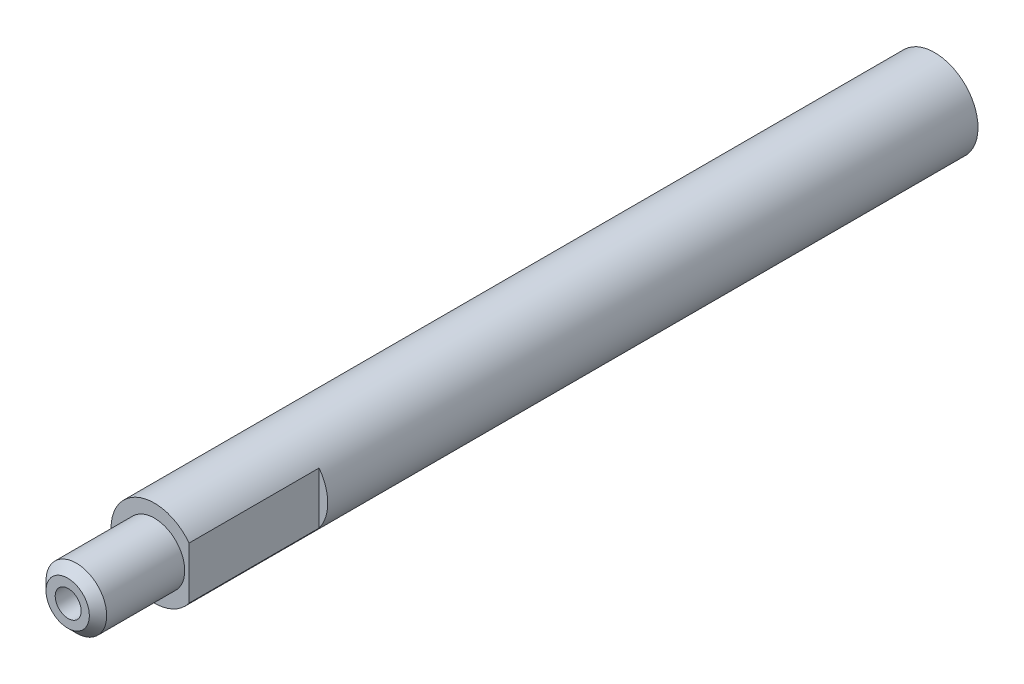
ISO-10303-21;
HEADER;
FILE_DESCRIPTION(('STEP AP214'),'2;1');
FILE_NAME('part.step','',(''),(''),'','','');
FILE_SCHEMA(('AUTOMOTIVE_DESIGN { 1 0 10303 214 1 1 1 1 }'));
ENDSEC;
DATA;
#1=APPLICATION_CONTEXT('core data for automotive mechanical design processes');
#2=APPLICATION_PROTOCOL_DEFINITION('international standard','automotive_design',2000,#1);
#3=PRODUCT_CONTEXT('',#1,'mechanical');
#4=PRODUCT('Part','Part','',(#3));
#5=PRODUCT_RELATED_PRODUCT_CATEGORY('part','',(#4));
#6=PRODUCT_DEFINITION_FORMATION('','',#4);
#7=PRODUCT_DEFINITION_CONTEXT('part definition',#1,'design');
#8=PRODUCT_DEFINITION('design','',#6,#7);
#9=PRODUCT_DEFINITION_SHAPE('','',#8);
#10=(LENGTH_UNIT() NAMED_UNIT(*) SI_UNIT(.MILLI.,.METRE.));
#11=(NAMED_UNIT(*) PLANE_ANGLE_UNIT() SI_UNIT($,.RADIAN.));
#12=(NAMED_UNIT(*) SI_UNIT($,.STERADIAN.) SOLID_ANGLE_UNIT());
#13=UNCERTAINTY_MEASURE_WITH_UNIT(LENGTH_MEASURE(1.E-05),#10,'distance_accuracy_value','');
#14=(GEOMETRIC_REPRESENTATION_CONTEXT(3) GLOBAL_UNCERTAINTY_ASSIGNED_CONTEXT((#13)) GLOBAL_UNIT_ASSIGNED_CONTEXT((#10,
#11,#12)) REPRESENTATION_CONTEXT('',''));
#15=CARTESIAN_POINT('',(0.,0.,0.));
#16=DIRECTION('',(0.,0.,1.));
#17=DIRECTION('',(1.,0.,0.));
#18=AXIS2_PLACEMENT_3D('',#15,#16,#17);
#19=CARTESIAN_POINT('',(0.,0.,100.));
#20=DIRECTION('',(0.,0.,-1.));
#21=DIRECTION('',(-1.,0.,0.));
#22=AXIS2_PLACEMENT_3D('',#19,#20,#21);
#23=CYLINDRICAL_SURFACE('',#22,5.);
#24=CARTESIAN_POINT('',(0.,0.,90.));
#25=DIRECTION('',(0.,0.,1.));
#26=DIRECTION('',(1.,0.,0.));
#27=AXIS2_PLACEMENT_3D('',#24,#25,#26);
#28=CIRCLE('',#27,5.);
#29=CARTESIAN_POINT('',(4.,3.,90.));
#30=VERTEX_POINT('',#29);
#31=CARTESIAN_POINT('',(4.,-3.,90.));
#32=VERTEX_POINT('',#31);
#33=EDGE_CURVE('E101',#30,#32,#28,.T.);
#34=ORIENTED_EDGE('',*,*,#33,.F.);
#35=DIRECTION('',(0.,0.,1.));
#36=VECTOR('',#35,1.);
#37=CARTESIAN_POINT('',(4.,3.,75.));
#38=LINE('',#37,#36);
#39=CARTESIAN_POINT('',(4.,3.,75.));
#40=VERTEX_POINT('',#39);
#41=EDGE_CURVE('E52',#40,#30,#38,.T.);
#42=ORIENTED_EDGE('',*,*,#41,.F.);
#43=CARTESIAN_POINT('',(0.,0.,75.));
#44=DIRECTION('',(0.,0.,1.));
#45=DIRECTION('',(1.,0.,0.));
#46=AXIS2_PLACEMENT_3D('',#43,#44,#45);
#47=CIRCLE('',#46,5.);
#48=CARTESIAN_POINT('',(4.,-3.,75.));
#49=VERTEX_POINT('',#48);
#50=EDGE_CURVE('E81',#49,#40,#47,.T.);
#51=ORIENTED_EDGE('',*,*,#50,.F.);
#52=DIRECTION('',(0.,0.,1.));
#53=VECTOR('',#52,1.);
#54=CARTESIAN_POINT('',(4.,-3.,75.));
#55=LINE('',#54,#53);
#56=EDGE_CURVE('E88',#49,#32,#55,.T.);
#57=ORIENTED_EDGE('',*,*,#56,.T.);
#58=EDGE_LOOP('',(#34,#42,#51,#57));
#59=FACE_BOUND('',#58,.T.);
#60=CARTESIAN_POINT('',(0.,0.,0.));
#61=DIRECTION('',(0.,0.,1.));
#62=DIRECTION('',(1.,0.,0.));
#63=AXIS2_PLACEMENT_3D('',#60,#61,#62);
#64=CIRCLE('',#63,5.);
#65=CARTESIAN_POINT('',(5.,0.,0.));
#66=VERTEX_POINT('',#65);
#67=EDGE_CURVE('E102',#66,#66,#64,.T.);
#68=ORIENTED_EDGE('',*,*,#67,.T.);
#69=EDGE_LOOP('',(#68));
#70=FACE_BOUND('',#69,.T.);
#71=ADVANCED_FACE('F37',(#59,#70),#23,.T.);
#72=CARTESIAN_POINT('',(0.,0.,0.));
#73=DIRECTION('',(0.,0.,1.));
#74=DIRECTION('',(1.,0.,0.));
#75=AXIS2_PLACEMENT_3D('',#72,#73,#74);
#76=PLANE('',#75);
#77=CARTESIAN_POINT('',(0.,0.,0.));
#78=DIRECTION('',(0.,0.,-1.));
#79=DIRECTION('',(-1.,0.,0.));
#80=AXIS2_PLACEMENT_3D('',#77,#78,#79);
#81=CIRCLE('',#80,2.);
#82=CARTESIAN_POINT('',(-2.,0.,0.));
#83=VERTEX_POINT('',#82);
#84=EDGE_CURVE('E78',#83,#83,#81,.T.);
#85=ORIENTED_EDGE('',*,*,#84,.F.);
#86=EDGE_LOOP('',(#85));
#87=FACE_BOUND('',#86,.T.);
#88=ORIENTED_EDGE('',*,*,#67,.F.);
#89=EDGE_LOOP('',(#88));
#90=FACE_BOUND('',#89,.T.);
#91=ADVANCED_FACE('F138',(#87,#90),#76,.F.);
#92=CARTESIAN_POINT('',(0.,0.,90.));
#93=DIRECTION('',(0.,0.,1.));
#94=DIRECTION('',(1.,0.,0.));
#95=AXIS2_PLACEMENT_3D('',#92,#93,#94);
#96=PLANE('',#95);
#97=DIRECTION('',(0.,-1.,0.));
#98=VECTOR('',#97,1.);
#99=CARTESIAN_POINT('',(4.,0.,90.));
#100=LINE('',#99,#98);
#101=EDGE_CURVE('E12',#30,#32,#100,.T.);
#102=ORIENTED_EDGE('',*,*,#101,.F.);
#103=ORIENTED_EDGE('',*,*,#33,.T.);
#104=EDGE_LOOP('',(#102,#103));
#105=FACE_BOUND('',#104,.T.);
#106=CARTESIAN_POINT('',(0.,0.,90.));
#107=DIRECTION('',(0.,0.,1.));
#108=DIRECTION('',(1.,0.,0.));
#109=AXIS2_PLACEMENT_3D('',#106,#107,#108);
#110=CIRCLE('',#109,3.5);
#111=CARTESIAN_POINT('',(3.5,0.,90.));
#112=VERTEX_POINT('',#111);
#113=EDGE_CURVE('E98',#112,#112,#110,.T.);
#114=ORIENTED_EDGE('',*,*,#113,.F.);
#115=EDGE_LOOP('',(#114));
#116=FACE_BOUND('',#115,.T.);
#117=ADVANCED_FACE('F143',(#105,#116),#96,.T.);
#118=CARTESIAN_POINT('',(0.,0.,90.));
#119=DIRECTION('',(0.,0.,1.));
#120=DIRECTION('',(1.,0.,0.));
#121=AXIS2_PLACEMENT_3D('',#118,#119,#120);
#122=CYLINDRICAL_SURFACE('',#121,3.5);
#123=CARTESIAN_POINT('',(0.,0.,99.));
#124=DIRECTION('',(0.,0.,1.));
#125=DIRECTION('',(1.,0.,0.));
#126=AXIS2_PLACEMENT_3D('',#123,#124,#125);
#127=CIRCLE('',#126,3.5);
#128=CARTESIAN_POINT('',(3.5,0.,99.));
#129=VERTEX_POINT('',#128);
#130=EDGE_CURVE('E46',#129,#129,#127,.F.);
#131=ORIENTED_EDGE('',*,*,#130,.T.);
#132=EDGE_LOOP('',(#131));
#133=FACE_BOUND('',#132,.T.);
#134=ORIENTED_EDGE('',*,*,#113,.T.);
#135=EDGE_LOOP('',(#134));
#136=FACE_BOUND('',#135,.T.);
#137=ADVANCED_FACE('F112',(#133,#136),#122,.T.);
#138=CARTESIAN_POINT('',(0.,0.,100.));
#139=DIRECTION('',(0.,0.,1.));
#140=DIRECTION('',(1.,0.,0.));
#141=AXIS2_PLACEMENT_3D('',#138,#139,#140);
#142=PLANE('',#141);
#143=CARTESIAN_POINT('',(0.,0.,100.));
#144=DIRECTION('',(0.,0.,1.));
#145=DIRECTION('',(1.,0.,0.));
#146=AXIS2_PLACEMENT_3D('',#143,#144,#145);
#147=CIRCLE('',#146,2.5);
#148=CARTESIAN_POINT('',(2.5,0.,100.));
#149=VERTEX_POINT('',#148);
#150=EDGE_CURVE('E105',#149,#149,#147,.T.);
#151=ORIENTED_EDGE('',*,*,#150,.T.);
#152=EDGE_LOOP('',(#151));
#153=FACE_BOUND('',#152,.T.);
#154=CARTESIAN_POINT('',(0.0621505563066973,-0.00731183015338076,100.));
#155=DIRECTION('',(0.,0.,1.));
#156=DIRECTION('',(1.,0.,0.));
#157=AXIS2_PLACEMENT_3D('',#154,#155,#156);
#158=CIRCLE('',#157,1.49999999999999);
#159=CARTESIAN_POINT('',(1.56215055630669,-0.00731183015338076,100.));
#160=VERTEX_POINT('',#159);
#161=EDGE_CURVE('E90',#160,#160,#158,.T.);
#162=ORIENTED_EDGE('',*,*,#161,.F.);
#163=EDGE_LOOP('',(#162));
#164=FACE_BOUND('',#163,.T.);
#165=ADVANCED_FACE('F121',(#153,#164),#142,.T.);
#166=CARTESIAN_POINT('',(0.0621505563066973,-0.00731183015338076,90.));
#167=DIRECTION('',(0.,0.,1.));
#168=DIRECTION('',(1.,0.,0.));
#169=AXIS2_PLACEMENT_3D('',#166,#167,#168);
#170=CONICAL_SURFACE('',#169,1.49999999999999,1.02974425867665);
#171=CARTESIAN_POINT('',(0.0621505563066959,-0.00731183015338076,89.0987090714587));
#172=VERTEX_POINT('',#171);
#173=VERTEX_LOOP('',#172);
#174=FACE_BOUND('',#173,.T.);
#175=CARTESIAN_POINT('',(0.0621505563066973,-0.00731183015338076,90.));
#176=DIRECTION('',(0.,0.,1.));
#177=DIRECTION('',(1.,0.,0.));
#178=AXIS2_PLACEMENT_3D('',#175,#176,#177);
#179=CIRCLE('',#178,1.49999999999999);
#180=CARTESIAN_POINT('',(1.56215055630668,-0.00731183015338076,90.));
#181=VERTEX_POINT('',#180);
#182=EDGE_CURVE('E95',#181,#181,#179,.T.);
#183=ORIENTED_EDGE('',*,*,#182,.T.);
#184=EDGE_LOOP('',(#183));
#185=FACE_BOUND('',#184,.T.);
#186=ADVANCED_FACE('F124',(#174,#185),#170,.F.);
#187=CARTESIAN_POINT('',(0.0621505563066973,-0.00731183015338076,100.));
#188=DIRECTION('',(0.,0.,1.));
#189=DIRECTION('',(1.,0.,0.));
#190=AXIS2_PLACEMENT_3D('',#187,#188,#189);
#191=CYLINDRICAL_SURFACE('',#190,1.49999999999999);
#192=ORIENTED_EDGE('',*,*,#182,.F.);
#193=EDGE_LOOP('',(#192));
#194=FACE_BOUND('',#193,.T.);
#195=ORIENTED_EDGE('',*,*,#161,.T.);
#196=EDGE_LOOP('',(#195));
#197=FACE_BOUND('',#196,.T.);
#198=ADVANCED_FACE('F118',(#194,#197),#191,.F.);
#199=CARTESIAN_POINT('',(0.,0.,100.));
#200=DIRECTION('',(0.,0.,-1.));
#201=DIRECTION('',(-1.,0.,0.));
#202=AXIS2_PLACEMENT_3D('',#199,#200,#201);
#203=CONICAL_SURFACE('',#202,2.5,0.78539816339744);
#204=ORIENTED_EDGE('',*,*,#130,.F.);
#205=EDGE_LOOP('',(#204));
#206=FACE_BOUND('',#205,.T.);
#207=ORIENTED_EDGE('',*,*,#150,.F.);
#208=EDGE_LOOP('',(#207));
#209=FACE_BOUND('',#208,.T.);
#210=ADVANCED_FACE('F40',(#206,#209),#203,.T.);
#211=CARTESIAN_POINT('',(4.,0.,75.));
#212=DIRECTION('',(-1.,0.,0.));
#213=DIRECTION('',(0.,0.,1.));
#214=AXIS2_PLACEMENT_3D('',#211,#212,#213);
#215=PLANE('',#214);
#216=ORIENTED_EDGE('',*,*,#101,.T.);
#217=ORIENTED_EDGE('',*,*,#56,.F.);
#218=DIRECTION('',(0.,-1.,0.));
#219=VECTOR('',#218,1.);
#220=CARTESIAN_POINT('',(4.,0.,75.));
#221=LINE('',#220,#219);
#222=EDGE_CURVE('E77',#40,#49,#221,.T.);
#223=ORIENTED_EDGE('',*,*,#222,.F.);
#224=ORIENTED_EDGE('',*,*,#41,.T.);
#225=EDGE_LOOP('',(#216,#217,#223,#224));
#226=FACE_BOUND('',#225,.T.);
#227=ADVANCED_FACE('F117',(#226),#215,.F.);
#228=CARTESIAN_POINT('',(0.,0.,75.));
#229=DIRECTION('',(0.,0.,1.));
#230=DIRECTION('',(1.,0.,0.));
#231=AXIS2_PLACEMENT_3D('',#228,#229,#230);
#232=PLANE('',#231);
#233=ORIENTED_EDGE('',*,*,#222,.T.);
#234=ORIENTED_EDGE('',*,*,#50,.T.);
#235=EDGE_LOOP('',(#233,#234));
#236=FACE_BOUND('',#235,.T.);
#237=ADVANCED_FACE('F71',(#236),#232,.T.);
#238=CARTESIAN_POINT('',(0.,0.,10.));
#239=DIRECTION('',(0.,0.,-1.));
#240=DIRECTION('',(-1.,0.,0.));
#241=AXIS2_PLACEMENT_3D('',#238,#239,#240);
#242=CONICAL_SURFACE('',#241,2.,1.02974425867665);
#243=CARTESIAN_POINT('',(0.,0.,11.2017212380551));
#244=VERTEX_POINT('',#243);
#245=VERTEX_LOOP('',#244);
#246=FACE_BOUND('',#245,.T.);
#247=CARTESIAN_POINT('',(0.,0.,10.));
#248=DIRECTION('',(0.,0.,-1.));
#249=DIRECTION('',(-1.,0.,0.));
#250=AXIS2_PLACEMENT_3D('',#247,#248,#249);
#251=CIRCLE('',#250,2.);
#252=CARTESIAN_POINT('',(-2.,0.,10.));
#253=VERTEX_POINT('',#252);
#254=EDGE_CURVE('E75',#253,#253,#251,.T.);
#255=ORIENTED_EDGE('',*,*,#254,.T.);
#256=EDGE_LOOP('',(#255));
#257=FACE_BOUND('',#256,.T.);
#258=ADVANCED_FACE('F67',(#246,#257),#242,.F.);
#259=CARTESIAN_POINT('',(0.,0.,0.));
#260=DIRECTION('',(0.,0.,-1.));
#261=DIRECTION('',(-1.,0.,0.));
#262=AXIS2_PLACEMENT_3D('',#259,#260,#261);
#263=CYLINDRICAL_SURFACE('',#262,2.);
#264=ORIENTED_EDGE('',*,*,#254,.F.);
#265=EDGE_LOOP('',(#264));
#266=FACE_BOUND('',#265,.T.);
#267=ORIENTED_EDGE('',*,*,#84,.T.);
#268=EDGE_LOOP('',(#267));
#269=FACE_BOUND('',#268,.T.);
#270=ADVANCED_FACE('F70',(#266,#269),#263,.F.);
#271=CLOSED_SHELL('',(#71,#91,#117,#137,#165,#186,#198,#210,#227,#237,#258,#270));
#272=MANIFOLD_SOLID_BREP('B2',#271);
#273=ADVANCED_BREP_SHAPE_REPRESENTATION('',(#18,#272),#14);
#274=SHAPE_DEFINITION_REPRESENTATION(#9,#273);
ENDSEC;
END-ISO-10303-21;
